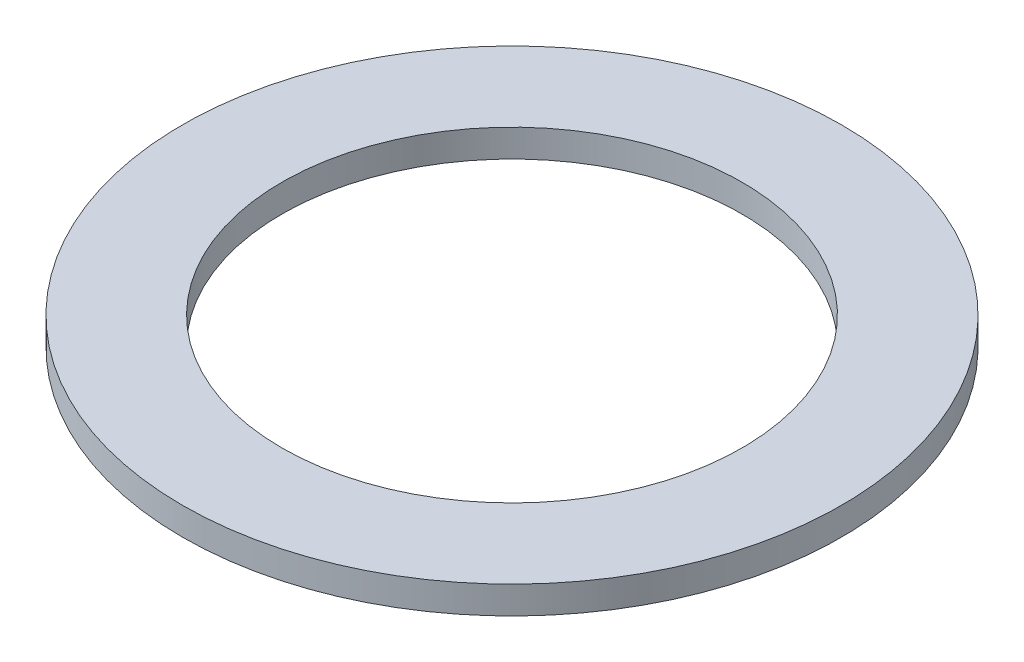
ISO-10303-21;
HEADER;
FILE_DESCRIPTION(('STEP AP214'),'2;1');
FILE_NAME('part.step','',(''),(''),'','','');
FILE_SCHEMA(('AUTOMOTIVE_DESIGN { 1 0 10303 214 1 1 1 1 }'));
ENDSEC;
DATA;
#1=APPLICATION_CONTEXT('core data for automotive mechanical design processes');
#2=APPLICATION_PROTOCOL_DEFINITION('international standard','automotive_design',2000,#1);
#3=PRODUCT_CONTEXT('',#1,'mechanical');
#4=PRODUCT('Part','Part','',(#3));
#5=PRODUCT_RELATED_PRODUCT_CATEGORY('part','',(#4));
#6=PRODUCT_DEFINITION_FORMATION('','',#4);
#7=PRODUCT_DEFINITION_CONTEXT('part definition',#1,'design');
#8=PRODUCT_DEFINITION('design','',#6,#7);
#9=PRODUCT_DEFINITION_SHAPE('','',#8);
#10=(LENGTH_UNIT() NAMED_UNIT(*) SI_UNIT(.MILLI.,.METRE.));
#11=(NAMED_UNIT(*) PLANE_ANGLE_UNIT() SI_UNIT($,.RADIAN.));
#12=(NAMED_UNIT(*) SI_UNIT($,.STERADIAN.) SOLID_ANGLE_UNIT());
#13=UNCERTAINTY_MEASURE_WITH_UNIT(LENGTH_MEASURE(1.E-05),#10,'distance_accuracy_value','');
#14=(GEOMETRIC_REPRESENTATION_CONTEXT(3) GLOBAL_UNCERTAINTY_ASSIGNED_CONTEXT((#13)) GLOBAL_UNIT_ASSIGNED_CONTEXT((#10,
#11,#12)) REPRESENTATION_CONTEXT('',''));
#15=CARTESIAN_POINT('',(0.,0.,0.));
#16=DIRECTION('',(0.,0.,1.));
#17=DIRECTION('',(1.,0.,0.));
#18=AXIS2_PLACEMENT_3D('',#15,#16,#17);
#19=CARTESIAN_POINT('',(0.,3.,0.));
#20=DIRECTION('',(0.,1.,0.));
#21=DIRECTION('',(0.,0.,1.));
#22=AXIS2_PLACEMENT_3D('',#19,#20,#21);
#23=PLANE('',#22);
#24=CARTESIAN_POINT('',(0.,3.,0.));
#25=DIRECTION('',(0.,1.,0.));
#26=DIRECTION('',(0.,0.,1.));
#27=AXIS2_PLACEMENT_3D('',#24,#25,#26);
#28=CIRCLE('',#27,25.);
#29=CARTESIAN_POINT('',(0.,3.,25.));
#30=VERTEX_POINT('',#29);
#31=EDGE_CURVE('E47',#30,#30,#28,.T.);
#32=ORIENTED_EDGE('',*,*,#31,.F.);
#33=EDGE_LOOP('',(#32));
#34=FACE_BOUND('',#33,.T.);
#35=CARTESIAN_POINT('',(0.,3.,0.));
#36=DIRECTION('',(0.,1.,0.));
#37=DIRECTION('',(0.,0.,1.));
#38=AXIS2_PLACEMENT_3D('',#35,#36,#37);
#39=CIRCLE('',#38,35.8);
#40=CARTESIAN_POINT('',(0.,3.,35.8));
#41=VERTEX_POINT('',#40);
#42=EDGE_CURVE('E10',#41,#41,#39,.T.);
#43=ORIENTED_EDGE('',*,*,#42,.T.);
#44=EDGE_LOOP('',(#43));
#45=FACE_BOUND('',#44,.T.);
#46=ADVANCED_FACE('F33',(#34,#45),#23,.T.);
#47=CARTESIAN_POINT('',(0.,0.,0.));
#48=DIRECTION('',(0.,1.,0.));
#49=DIRECTION('',(0.,0.,1.));
#50=AXIS2_PLACEMENT_3D('',#47,#48,#49);
#51=PLANE('',#50);
#52=CARTESIAN_POINT('',(0.,0.,0.));
#53=DIRECTION('',(0.,1.,0.));
#54=DIRECTION('',(0.,0.,1.));
#55=AXIS2_PLACEMENT_3D('',#52,#53,#54);
#56=CIRCLE('',#55,25.);
#57=CARTESIAN_POINT('',(0.,0.,25.));
#58=VERTEX_POINT('',#57);
#59=EDGE_CURVE('E37',#58,#58,#56,.T.);
#60=ORIENTED_EDGE('',*,*,#59,.T.);
#61=EDGE_LOOP('',(#60));
#62=FACE_BOUND('',#61,.T.);
#63=CARTESIAN_POINT('',(0.,0.,0.));
#64=DIRECTION('',(0.,1.,0.));
#65=DIRECTION('',(0.,0.,1.));
#66=AXIS2_PLACEMENT_3D('',#63,#64,#65);
#67=CIRCLE('',#66,35.8);
#68=CARTESIAN_POINT('',(0.,0.,35.8));
#69=VERTEX_POINT('',#68);
#70=EDGE_CURVE('E41',#69,#69,#67,.T.);
#71=ORIENTED_EDGE('',*,*,#70,.F.);
#72=EDGE_LOOP('',(#71));
#73=FACE_BOUND('',#72,.T.);
#74=ADVANCED_FACE('F54',(#62,#73),#51,.F.);
#75=CARTESIAN_POINT('',(0.,3.,0.));
#76=DIRECTION('',(0.,-1.,0.));
#77=DIRECTION('',(0.,0.,-1.));
#78=AXIS2_PLACEMENT_3D('',#75,#76,#77);
#79=CYLINDRICAL_SURFACE('',#78,35.8);
#80=ORIENTED_EDGE('',*,*,#42,.F.);
#81=EDGE_LOOP('',(#80));
#82=FACE_BOUND('',#81,.T.);
#83=ORIENTED_EDGE('',*,*,#70,.T.);
#84=EDGE_LOOP('',(#83));
#85=FACE_BOUND('',#84,.T.);
#86=ADVANCED_FACE('F35',(#82,#85),#79,.T.);
#87=CARTESIAN_POINT('',(0.,-7.,0.));
#88=DIRECTION('',(0.,1.,0.));
#89=DIRECTION('',(0.,0.,1.));
#90=AXIS2_PLACEMENT_3D('',#87,#88,#89);
#91=CYLINDRICAL_SURFACE('',#90,25.);
#92=ORIENTED_EDGE('',*,*,#31,.T.);
#93=EDGE_LOOP('',(#92));
#94=FACE_BOUND('',#93,.T.);
#95=ORIENTED_EDGE('',*,*,#59,.F.);
#96=EDGE_LOOP('',(#95));
#97=FACE_BOUND('',#96,.T.);
#98=ADVANCED_FACE('F57',(#94,#97),#91,.F.);
#99=CLOSED_SHELL('',(#46,#74,#86,#98));
#100=MANIFOLD_SOLID_BREP('B2',#99);
#101=ADVANCED_BREP_SHAPE_REPRESENTATION('',(#18,#100),#14);
#102=SHAPE_DEFINITION_REPRESENTATION(#9,#101);
ENDSEC;
END-ISO-10303-21;
